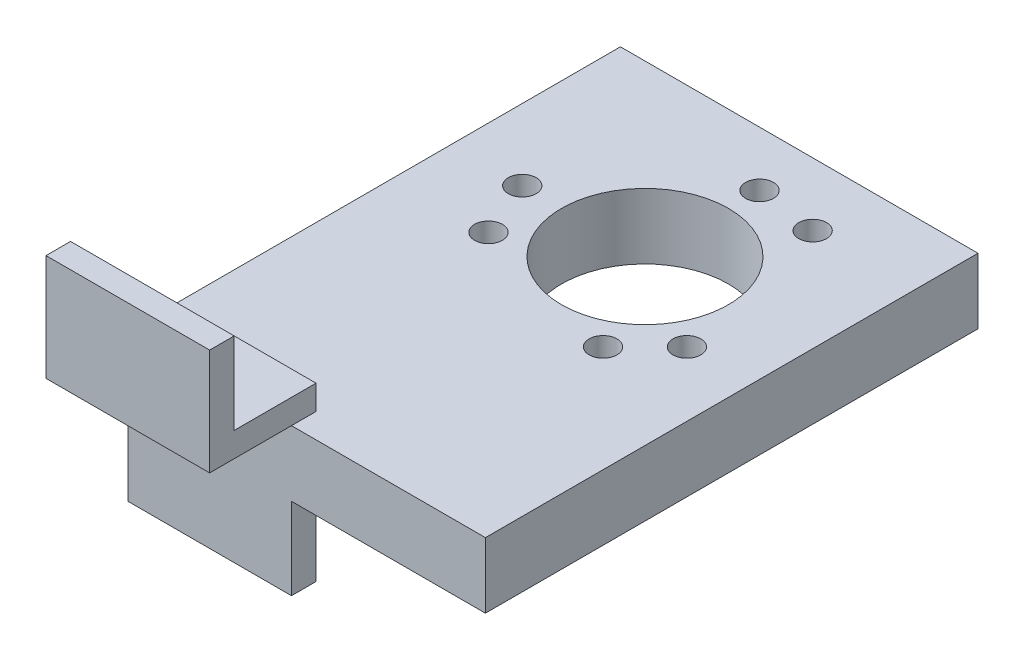
ISO-10303-21;
HEADER;
FILE_DESCRIPTION(('STEP AP214'),'2;1');
FILE_NAME('part.step','',(''),(''),'','','');
FILE_SCHEMA(('AUTOMOTIVE_DESIGN { 1 0 10303 214 1 1 1 1 }'));
ENDSEC;
DATA;
#1=APPLICATION_CONTEXT('core data for automotive mechanical design processes');
#2=APPLICATION_PROTOCOL_DEFINITION('international standard','automotive_design',2000,#1);
#3=PRODUCT_CONTEXT('',#1,'mechanical');
#4=PRODUCT('Part','Part','',(#3));
#5=PRODUCT_RELATED_PRODUCT_CATEGORY('part','',(#4));
#6=PRODUCT_DEFINITION_FORMATION('','',#4);
#7=PRODUCT_DEFINITION_CONTEXT('part definition',#1,'design');
#8=PRODUCT_DEFINITION('design','',#6,#7);
#9=PRODUCT_DEFINITION_SHAPE('','',#8);
#10=(LENGTH_UNIT() NAMED_UNIT(*) SI_UNIT(.MILLI.,.METRE.));
#11=(NAMED_UNIT(*) PLANE_ANGLE_UNIT() SI_UNIT($,.RADIAN.));
#12=(NAMED_UNIT(*) SI_UNIT($,.STERADIAN.) SOLID_ANGLE_UNIT());
#13=UNCERTAINTY_MEASURE_WITH_UNIT(LENGTH_MEASURE(1.E-05),#10,'distance_accuracy_value','');
#14=(GEOMETRIC_REPRESENTATION_CONTEXT(3) GLOBAL_UNCERTAINTY_ASSIGNED_CONTEXT((#13)) GLOBAL_UNIT_ASSIGNED_CONTEXT((#10,
#11,#12)) REPRESENTATION_CONTEXT('',''));
#15=CARTESIAN_POINT('',(0.,0.,0.));
#16=DIRECTION('',(0.,0.,1.));
#17=DIRECTION('',(1.,0.,0.));
#18=AXIS2_PLACEMENT_3D('',#15,#16,#17);
#19=CARTESIAN_POINT('',(0.,11.,0.));
#20=DIRECTION('',(0.,-1.,0.));
#21=DIRECTION('',(0.,0.,-1.));
#22=AXIS2_PLACEMENT_3D('',#19,#20,#21);
#23=PLANE('',#22);
#24=DIRECTION('',(-1.,0.,0.));
#25=VECTOR('',#24,1.);
#26=CARTESIAN_POINT('',(-23.7,11.,7.));
#27=LINE('',#26,#25);
#28=CARTESIAN_POINT('',(-3.7,11.,7.));
#29=VERTEX_POINT('',#28);
#30=CARTESIAN_POINT('',(-23.7,11.,7.));
#31=VERTEX_POINT('',#30);
#32=EDGE_CURVE('E57',#29,#31,#27,.T.);
#33=ORIENTED_EDGE('',*,*,#32,.F.);
#34=DIRECTION('',(0.,0.,-1.));
#35=VECTOR('',#34,1.);
#36=CARTESIAN_POINT('',(-3.7,11.,0.));
#37=LINE('',#36,#35);
#38=CARTESIAN_POINT('',(-3.7,11.,-3.));
#39=VERTEX_POINT('',#38);
#40=EDGE_CURVE('E199',#29,#39,#37,.T.);
#41=ORIENTED_EDGE('',*,*,#40,.T.);
#42=DIRECTION('',(-1.,0.,0.));
#43=VECTOR('',#42,1.);
#44=CARTESIAN_POINT('',(-23.7,11.,-3.));
#45=LINE('',#44,#43);
#46=CARTESIAN_POINT('',(-23.7,11.,-3.));
#47=VERTEX_POINT('',#46);
#48=EDGE_CURVE('E203',#39,#47,#45,.T.);
#49=ORIENTED_EDGE('',*,*,#48,.T.);
#50=DIRECTION('',(0.,0.,1.));
#51=VECTOR('',#50,1.);
#52=CARTESIAN_POINT('',(-23.7,11.,0.));
#53=LINE('',#52,#51);
#54=EDGE_CURVE('E196',#47,#31,#53,.T.);
#55=ORIENTED_EDGE('',*,*,#54,.T.);
#56=EDGE_LOOP('',(#33,#41,#49,#55));
#57=FACE_BOUND('',#56,.T.);
#58=ADVANCED_FACE('F41',(#57),#23,.F.);
#59=CARTESIAN_POINT('',(0.,8.,0.));
#60=DIRECTION('',(0.,0.,-1.));
#61=DIRECTION('',(-1.,0.,0.));
#62=AXIS2_PLACEMENT_3D('',#59,#60,#61);
#63=PLANE('',#62);
#64=DIRECTION('',(1.,0.,0.));
#65=VECTOR('',#64,1.);
#66=CARTESIAN_POINT('',(-23.7,8.,0.));
#67=LINE('',#66,#65);
#68=CARTESIAN_POINT('',(-23.7,8.,0.));
#69=VERTEX_POINT('',#68);
#70=CARTESIAN_POINT('',(-3.7,8.,0.));
#71=VERTEX_POINT('',#70);
#72=EDGE_CURVE('E65',#69,#71,#67,.T.);
#73=ORIENTED_EDGE('',*,*,#72,.F.);
#74=DIRECTION('',(0.,-1.,0.));
#75=VECTOR('',#74,1.);
#76=CARTESIAN_POINT('',(-23.7,8.,0.));
#77=LINE('',#76,#75);
#78=CARTESIAN_POINT('',(-23.7,-10.,0.));
#79=VERTEX_POINT('',#78);
#80=EDGE_CURVE('E342',#69,#79,#77,.T.);
#81=ORIENTED_EDGE('',*,*,#80,.T.);
#82=DIRECTION('',(-1.,0.,0.));
#83=VECTOR('',#82,1.);
#84=CARTESIAN_POINT('',(-23.7,-10.,0.));
#85=LINE('',#84,#83);
#86=CARTESIAN_POINT('',(-3.7,-10.,0.));
#87=VERTEX_POINT('',#86);
#88=EDGE_CURVE('E232',#87,#79,#85,.T.);
#89=ORIENTED_EDGE('',*,*,#88,.F.);
#90=DIRECTION('',(0.,1.,0.));
#91=VECTOR('',#90,1.);
#92=CARTESIAN_POINT('',(-3.7,-10.,0.));
#93=LINE('',#92,#91);
#94=CARTESIAN_POINT('',(-3.7,0.,0.));
#95=VERTEX_POINT('',#94);
#96=EDGE_CURVE('E236',#87,#95,#93,.T.);
#97=ORIENTED_EDGE('',*,*,#96,.T.);
#98=DIRECTION('',(1.,0.,0.));
#99=VECTOR('',#98,1.);
#100=CARTESIAN_POINT('',(0.,0.,0.));
#101=LINE('',#100,#99);
#102=CARTESIAN_POINT('',(20.,0.,0.));
#103=VERTEX_POINT('',#102);
#104=EDGE_CURVE('E333',#95,#103,#101,.T.);
#105=ORIENTED_EDGE('',*,*,#104,.T.);
#106=DIRECTION('',(0.,-1.,0.));
#107=VECTOR('',#106,1.);
#108=CARTESIAN_POINT('',(20.,8.,0.));
#109=LINE('',#108,#107);
#110=CARTESIAN_POINT('',(20.,8.,0.));
#111=VERTEX_POINT('',#110);
#112=EDGE_CURVE('E298',#111,#103,#109,.T.);
#113=ORIENTED_EDGE('',*,*,#112,.F.);
#114=DIRECTION('',(1.,0.,0.));
#115=VECTOR('',#114,1.);
#116=CARTESIAN_POINT('',(0.,8.,0.));
#117=LINE('',#116,#115);
#118=EDGE_CURVE('E291',#71,#111,#117,.T.);
#119=ORIENTED_EDGE('',*,*,#118,.F.);
#120=EDGE_LOOP('',(#73,#81,#89,#97,#105,#113,#119));
#121=FACE_BOUND('',#120,.T.);
#122=ADVANCED_FACE('F388',(#121),#63,.F.);
#123=CARTESIAN_POINT('',(0.,0.,0.));
#124=DIRECTION('',(0.,1.,0.));
#125=DIRECTION('',(0.,0.,1.));
#126=AXIS2_PLACEMENT_3D('',#123,#124,#125);
#127=PLANE('',#126);
#128=CARTESIAN_POINT('',(-12.1243556529821,0.,-32.5));
#129=DIRECTION('',(0.,1.,0.));
#130=DIRECTION('',(0.,0.,1.));
#131=AXIS2_PLACEMENT_3D('',#128,#129,#130);
#132=CIRCLE('',#131,1.7);
#133=CARTESIAN_POINT('',(-12.1243556529821,0.,-30.8));
#134=VERTEX_POINT('',#133);
#135=EDGE_CURVE('E260',#134,#134,#132,.T.);
#136=ORIENTED_EDGE('',*,*,#135,.T.);
#137=EDGE_LOOP('',(#136));
#138=FACE_BOUND('',#137,.T.);
#139=CARTESIAN_POINT('',(7.,0.,-27.3756443470179));
#140=DIRECTION('',(0.,1.,0.));
#141=DIRECTION('',(0.,0.,1.));
#142=AXIS2_PLACEMENT_3D('',#139,#140,#141);
#143=CIRCLE('',#142,1.7);
#144=CARTESIAN_POINT('',(7.,0.,-25.6756443470179));
#145=VERTEX_POINT('',#144);
#146=EDGE_CURVE('E318',#145,#145,#143,.T.);
#147=ORIENTED_EDGE('',*,*,#146,.T.);
#148=EDGE_LOOP('',(#147));
#149=FACE_BOUND('',#148,.T.);
#150=CARTESIAN_POINT('',(-15.,0.,-39.5));
#151=DIRECTION('',(0.,1.,0.));
#152=DIRECTION('',(0.,0.,1.));
#153=AXIS2_PLACEMENT_3D('',#150,#151,#152);
#154=CIRCLE('',#153,1.7);
#155=CARTESIAN_POINT('',(-15.,0.,-37.8));
#156=VERTEX_POINT('',#155);
#157=EDGE_CURVE('E314',#156,#156,#154,.T.);
#158=ORIENTED_EDGE('',*,*,#157,.T.);
#159=EDGE_LOOP('',(#158));
#160=FACE_BOUND('',#159,.T.);
#161=CARTESIAN_POINT('',(12.1243556529821,0.,-32.5));
#162=DIRECTION('',(0.,1.,0.));
#163=DIRECTION('',(0.,0.,1.));
#164=AXIS2_PLACEMENT_3D('',#161,#162,#163);
#165=CIRCLE('',#164,1.7);
#166=CARTESIAN_POINT('',(12.1243556529821,0.,-30.8));
#167=VERTEX_POINT('',#166);
#168=EDGE_CURVE('E310',#167,#167,#165,.T.);
#169=ORIENTED_EDGE('',*,*,#168,.T.);
#170=EDGE_LOOP('',(#169));
#171=FACE_BOUND('',#170,.T.);
#172=CARTESIAN_POINT('',(0.,0.,-39.5));
#173=DIRECTION('',(0.,1.,0.));
#174=DIRECTION('',(0.,0.,1.));
#175=AXIS2_PLACEMENT_3D('',#172,#173,#174);
#176=CIRCLE('',#175,10.2);
#177=CARTESIAN_POINT('',(0.,0.,-29.3));
#178=VERTEX_POINT('',#177);
#179=EDGE_CURVE('E306',#178,#178,#176,.T.);
#180=ORIENTED_EDGE('',*,*,#179,.T.);
#181=EDGE_LOOP('',(#180));
#182=FACE_BOUND('',#181,.T.);
#183=CARTESIAN_POINT('',(0.,0.,-53.5));
#184=DIRECTION('',(0.,1.,0.));
#185=DIRECTION('',(0.,0.,1.));
#186=AXIS2_PLACEMENT_3D('',#183,#184,#185);
#187=CIRCLE('',#186,1.7);
#188=CARTESIAN_POINT('',(0.,0.,-51.8));
#189=VERTEX_POINT('',#188);
#190=EDGE_CURVE('E302',#189,#189,#187,.T.);
#191=ORIENTED_EDGE('',*,*,#190,.T.);
#192=EDGE_LOOP('',(#191));
#193=FACE_BOUND('',#192,.T.);
#194=CARTESIAN_POINT('',(7.5,0.,-52.4903810567666));
#195=DIRECTION('',(0.,1.,0.));
#196=DIRECTION('',(0.,0.,1.));
#197=AXIS2_PLACEMENT_3D('',#194,#195,#196);
#198=CIRCLE('',#197,1.7);
#199=CARTESIAN_POINT('',(7.5,0.,-50.7903810567666));
#200=VERTEX_POINT('',#199);
#201=EDGE_CURVE('E254',#200,#200,#198,.T.);
#202=ORIENTED_EDGE('',*,*,#201,.T.);
#203=EDGE_LOOP('',(#202));
#204=FACE_BOUND('',#203,.T.);
#205=DIRECTION('',(0.,0.,1.));
#206=VECTOR('',#205,1.);
#207=CARTESIAN_POINT('',(-3.7,0.,0.));
#208=LINE('',#207,#206);
#209=CARTESIAN_POINT('',(-3.7,0.,-3.));
#210=VERTEX_POINT('',#209);
#211=EDGE_CURVE('E226',#210,#95,#208,.T.);
#212=ORIENTED_EDGE('',*,*,#211,.F.);
#213=DIRECTION('',(1.,0.,0.));
#214=VECTOR('',#213,1.);
#215=CARTESIAN_POINT('',(-23.7,0.,-3.));
#216=LINE('',#215,#214);
#217=CARTESIAN_POINT('',(-23.7,0.,-3.));
#218=VERTEX_POINT('',#217);
#219=EDGE_CURVE('E220',#218,#210,#216,.T.);
#220=ORIENTED_EDGE('',*,*,#219,.F.);
#221=DIRECTION('',(0.,0.,-1.));
#222=VECTOR('',#221,1.);
#223=CARTESIAN_POINT('',(-23.7,0.,0.));
#224=LINE('',#223,#222);
#225=CARTESIAN_POINT('',(-23.7,0.,-60.2));
#226=VERTEX_POINT('',#225);
#227=EDGE_CURVE('E330',#218,#226,#224,.T.);
#228=ORIENTED_EDGE('',*,*,#227,.T.);
#229=DIRECTION('',(1.,0.,0.));
#230=VECTOR('',#229,1.);
#231=CARTESIAN_POINT('',(0.,0.,-60.2));
#232=LINE('',#231,#230);
#233=CARTESIAN_POINT('',(20.,0.,-60.2));
#234=VERTEX_POINT('',#233);
#235=EDGE_CURVE('E326',#226,#234,#232,.T.);
#236=ORIENTED_EDGE('',*,*,#235,.T.);
#237=DIRECTION('',(0.,0.,1.));
#238=VECTOR('',#237,1.);
#239=CARTESIAN_POINT('',(20.,0.,0.));
#240=LINE('',#239,#238);
#241=EDGE_CURVE('E322',#234,#103,#240,.T.);
#242=ORIENTED_EDGE('',*,*,#241,.T.);
#243=ORIENTED_EDGE('',*,*,#104,.F.);
#244=EDGE_LOOP('',(#212,#220,#228,#236,#242,#243));
#245=FACE_BOUND('',#244,.T.);
#246=ADVANCED_FACE('F354',(#138,#149,#160,#171,#182,#193,#204,#245),#127,.F.);
#247=CARTESIAN_POINT('',(20.,8.,0.));
#248=DIRECTION('',(1.,0.,0.));
#249=DIRECTION('',(0.,0.,-1.));
#250=AXIS2_PLACEMENT_3D('',#247,#248,#249);
#251=PLANE('',#250);
#252=ORIENTED_EDGE('',*,*,#241,.F.);
#253=DIRECTION('',(0.,-1.,0.));
#254=VECTOR('',#253,1.);
#255=CARTESIAN_POINT('',(20.,8.,-60.2));
#256=LINE('',#255,#254);
#257=CARTESIAN_POINT('',(20.,8.,-60.2));
#258=VERTEX_POINT('',#257);
#259=EDGE_CURVE('E11',#258,#234,#256,.T.);
#260=ORIENTED_EDGE('',*,*,#259,.F.);
#261=DIRECTION('',(0.,0.,1.));
#262=VECTOR('',#261,1.);
#263=CARTESIAN_POINT('',(20.,8.,0.));
#264=LINE('',#263,#262);
#265=EDGE_CURVE('E280',#258,#111,#264,.T.);
#266=ORIENTED_EDGE('',*,*,#265,.T.);
#267=ORIENTED_EDGE('',*,*,#112,.T.);
#268=EDGE_LOOP('',(#252,#260,#266,#267));
#269=FACE_BOUND('',#268,.T.);
#270=ADVANCED_FACE('F387',(#269),#251,.T.);
#271=CARTESIAN_POINT('',(0.,8.,-60.2));
#272=DIRECTION('',(0.,0.,-1.));
#273=DIRECTION('',(-1.,0.,0.));
#274=AXIS2_PLACEMENT_3D('',#271,#272,#273);
#275=PLANE('',#274);
#276=ORIENTED_EDGE('',*,*,#235,.F.);
#277=DIRECTION('',(0.,-1.,0.));
#278=VECTOR('',#277,1.);
#279=CARTESIAN_POINT('',(-23.7,8.,-60.2));
#280=LINE('',#279,#278);
#281=CARTESIAN_POINT('',(-23.7,8.,-60.2));
#282=VERTEX_POINT('',#281);
#283=EDGE_CURVE('E50',#282,#226,#280,.T.);
#284=ORIENTED_EDGE('',*,*,#283,.F.);
#285=DIRECTION('',(1.,0.,0.));
#286=VECTOR('',#285,1.);
#287=CARTESIAN_POINT('',(0.,8.,-60.2));
#288=LINE('',#287,#286);
#289=EDGE_CURVE('E284',#282,#258,#288,.T.);
#290=ORIENTED_EDGE('',*,*,#289,.T.);
#291=ORIENTED_EDGE('',*,*,#259,.T.);
#292=EDGE_LOOP('',(#276,#284,#290,#291));
#293=FACE_BOUND('',#292,.T.);
#294=ADVANCED_FACE('F351',(#293),#275,.T.);
#295=CARTESIAN_POINT('',(-23.7,8.,0.));
#296=DIRECTION('',(-1.,0.,0.));
#297=DIRECTION('',(0.,0.,1.));
#298=AXIS2_PLACEMENT_3D('',#295,#296,#297);
#299=PLANE('',#298);
#300=ORIENTED_EDGE('',*,*,#227,.F.);
#301=DIRECTION('',(0.,1.,0.));
#302=VECTOR('',#301,1.);
#303=CARTESIAN_POINT('',(-23.7,-10.,-3.));
#304=LINE('',#303,#302);
#305=CARTESIAN_POINT('',(-23.7,-10.,-3.));
#306=VERTEX_POINT('',#305);
#307=EDGE_CURVE('E250',#306,#218,#304,.T.);
#308=ORIENTED_EDGE('',*,*,#307,.F.);
#309=DIRECTION('',(0.,0.,-1.));
#310=VECTOR('',#309,1.);
#311=CARTESIAN_POINT('',(-23.7,-10.,0.));
#312=LINE('',#311,#310);
#313=EDGE_CURVE('E221',#79,#306,#312,.T.);
#314=ORIENTED_EDGE('',*,*,#313,.F.);
#315=ORIENTED_EDGE('',*,*,#80,.F.);
#316=DIRECTION('',(0.,0.,-1.));
#317=VECTOR('',#316,1.);
#318=CARTESIAN_POINT('',(-23.7,8.,10.));
#319=LINE('',#318,#317);
#320=CARTESIAN_POINT('',(-23.7,8.,10.));
#321=VERTEX_POINT('',#320);
#322=EDGE_CURVE('E148',#321,#69,#319,.T.);
#323=ORIENTED_EDGE('',*,*,#322,.F.);
#324=DIRECTION('',(0.,-1.,0.));
#325=VECTOR('',#324,1.);
#326=CARTESIAN_POINT('',(-23.7,11.,10.));
#327=LINE('',#326,#325);
#328=CARTESIAN_POINT('',(-23.7,21.,10.));
#329=VERTEX_POINT('',#328);
#330=EDGE_CURVE('E140',#329,#321,#327,.T.);
#331=ORIENTED_EDGE('',*,*,#330,.F.);
#332=DIRECTION('',(0.,0.,1.));
#333=VECTOR('',#332,1.);
#334=CARTESIAN_POINT('',(-23.7,21.,10.));
#335=LINE('',#334,#333);
#336=CARTESIAN_POINT('',(-23.7,21.,7.));
#337=VERTEX_POINT('',#336);
#338=EDGE_CURVE('E146',#337,#329,#335,.T.);
#339=ORIENTED_EDGE('',*,*,#338,.F.);
#340=DIRECTION('',(0.,-1.,0.));
#341=VECTOR('',#340,1.);
#342=CARTESIAN_POINT('',(-23.7,21.,7.));
#343=LINE('',#342,#341);
#344=EDGE_CURVE('E175',#337,#31,#343,.T.);
#345=ORIENTED_EDGE('',*,*,#344,.T.);
#346=ORIENTED_EDGE('',*,*,#54,.F.);
#347=DIRECTION('',(0.,-1.,0.));
#348=VECTOR('',#347,1.);
#349=CARTESIAN_POINT('',(-23.7,11.,-3.));
#350=LINE('',#349,#348);
#351=CARTESIAN_POINT('',(-23.7,8.,-3.));
#352=VERTEX_POINT('',#351);
#353=EDGE_CURVE('E206',#47,#352,#350,.T.);
#354=ORIENTED_EDGE('',*,*,#353,.T.);
#355=DIRECTION('',(0.,0.,-1.));
#356=VECTOR('',#355,1.);
#357=CARTESIAN_POINT('',(-23.7,8.,0.));
#358=LINE('',#357,#356);
#359=EDGE_CURVE('E288',#352,#282,#358,.T.);
#360=ORIENTED_EDGE('',*,*,#359,.T.);
#361=ORIENTED_EDGE('',*,*,#283,.T.);
#362=EDGE_LOOP('',(#300,#308,#314,#315,#323,#331,#339,#345,#346,#354,#360,#361));
#363=FACE_BOUND('',#362,.T.);
#364=ADVANCED_FACE('F143',(#363),#299,.T.);
#365=CARTESIAN_POINT('',(7.,8.,-27.3756443470179));
#366=DIRECTION('',(0.,-1.,0.));
#367=DIRECTION('',(0.,0.,-1.));
#368=AXIS2_PLACEMENT_3D('',#365,#366,#367);
#369=CYLINDRICAL_SURFACE('',#368,1.7);
#370=CARTESIAN_POINT('',(7.,8.,-27.3756443470179));
#371=DIRECTION('',(0.,1.,0.));
#372=DIRECTION('',(0.,0.,1.));
#373=AXIS2_PLACEMENT_3D('',#370,#371,#372);
#374=CIRCLE('',#373,1.7);
#375=CARTESIAN_POINT('',(7.,8.,-25.6756443470179));
#376=VERTEX_POINT('',#375);
#377=EDGE_CURVE('E276',#376,#376,#374,.T.);
#378=ORIENTED_EDGE('',*,*,#377,.T.);
#379=EDGE_LOOP('',(#378));
#380=FACE_BOUND('',#379,.T.);
#381=ORIENTED_EDGE('',*,*,#146,.F.);
#382=EDGE_LOOP('',(#381));
#383=FACE_BOUND('',#382,.T.);
#384=ADVANCED_FACE('F403',(#380,#383),#369,.F.);
#385=CARTESIAN_POINT('',(-15.,8.,-39.5));
#386=DIRECTION('',(0.,-1.,0.));
#387=DIRECTION('',(0.,0.,-1.));
#388=AXIS2_PLACEMENT_3D('',#385,#386,#387);
#389=CYLINDRICAL_SURFACE('',#388,1.7);
#390=CARTESIAN_POINT('',(-15.,8.,-39.5));
#391=DIRECTION('',(0.,1.,0.));
#392=DIRECTION('',(0.,0.,1.));
#393=AXIS2_PLACEMENT_3D('',#390,#391,#392);
#394=CIRCLE('',#393,1.7);
#395=CARTESIAN_POINT('',(-15.,8.,-37.8));
#396=VERTEX_POINT('',#395);
#397=EDGE_CURVE('E272',#396,#396,#394,.T.);
#398=ORIENTED_EDGE('',*,*,#397,.T.);
#399=EDGE_LOOP('',(#398));
#400=FACE_BOUND('',#399,.T.);
#401=ORIENTED_EDGE('',*,*,#157,.F.);
#402=EDGE_LOOP('',(#401));
#403=FACE_BOUND('',#402,.T.);
#404=ADVANCED_FACE('F410',(#400,#403),#389,.F.);
#405=CARTESIAN_POINT('',(12.1243556529821,8.,-32.5));
#406=DIRECTION('',(0.,-1.,0.));
#407=DIRECTION('',(0.,0.,-1.));
#408=AXIS2_PLACEMENT_3D('',#405,#406,#407);
#409=CYLINDRICAL_SURFACE('',#408,1.7);
#410=CARTESIAN_POINT('',(12.1243556529821,8.,-32.5));
#411=DIRECTION('',(0.,1.,0.));
#412=DIRECTION('',(0.,0.,1.));
#413=AXIS2_PLACEMENT_3D('',#410,#411,#412);
#414=CIRCLE('',#413,1.7);
#415=CARTESIAN_POINT('',(12.1243556529821,8.,-30.8));
#416=VERTEX_POINT('',#415);
#417=EDGE_CURVE('E268',#416,#416,#414,.T.);
#418=ORIENTED_EDGE('',*,*,#417,.T.);
#419=EDGE_LOOP('',(#418));
#420=FACE_BOUND('',#419,.T.);
#421=ORIENTED_EDGE('',*,*,#168,.F.);
#422=EDGE_LOOP('',(#421));
#423=FACE_BOUND('',#422,.T.);
#424=ADVANCED_FACE('F414',(#420,#423),#409,.F.);
#425=CARTESIAN_POINT('',(0.,8.,-39.5));
#426=DIRECTION('',(0.,-1.,0.));
#427=DIRECTION('',(0.,0.,-1.));
#428=AXIS2_PLACEMENT_3D('',#425,#426,#427);
#429=CYLINDRICAL_SURFACE('',#428,10.2);
#430=CARTESIAN_POINT('',(0.,8.,-39.5));
#431=DIRECTION('',(0.,1.,0.));
#432=DIRECTION('',(0.,0.,1.));
#433=AXIS2_PLACEMENT_3D('',#430,#431,#432);
#434=CIRCLE('',#433,10.2);
#435=CARTESIAN_POINT('',(0.,8.,-29.3));
#436=VERTEX_POINT('',#435);
#437=EDGE_CURVE('E264',#436,#436,#434,.T.);
#438=ORIENTED_EDGE('',*,*,#437,.T.);
#439=EDGE_LOOP('',(#438));
#440=FACE_BOUND('',#439,.T.);
#441=ORIENTED_EDGE('',*,*,#179,.F.);
#442=EDGE_LOOP('',(#441));
#443=FACE_BOUND('',#442,.T.);
#444=ADVANCED_FACE('F418',(#440,#443),#429,.F.);
#445=CARTESIAN_POINT('',(0.,8.,-53.5));
#446=DIRECTION('',(0.,-1.,0.));
#447=DIRECTION('',(0.,0.,-1.));
#448=AXIS2_PLACEMENT_3D('',#445,#446,#447);
#449=CYLINDRICAL_SURFACE('',#448,1.7);
#450=CARTESIAN_POINT('',(0.,8.,-53.5));
#451=DIRECTION('',(0.,1.,0.));
#452=DIRECTION('',(0.,0.,1.));
#453=AXIS2_PLACEMENT_3D('',#450,#451,#452);
#454=CIRCLE('',#453,1.7);
#455=CARTESIAN_POINT('',(0.,8.,-51.8));
#456=VERTEX_POINT('',#455);
#457=EDGE_CURVE('E259',#456,#456,#454,.T.);
#458=ORIENTED_EDGE('',*,*,#457,.T.);
#459=EDGE_LOOP('',(#458));
#460=FACE_BOUND('',#459,.T.);
#461=ORIENTED_EDGE('',*,*,#190,.F.);
#462=EDGE_LOOP('',(#461));
#463=FACE_BOUND('',#462,.T.);
#464=ADVANCED_FACE('F421',(#460,#463),#449,.F.);
#465=CARTESIAN_POINT('',(7.5,8.,-52.4903810567666));
#466=DIRECTION('',(0.,-1.,0.));
#467=DIRECTION('',(0.,0.,-1.));
#468=AXIS2_PLACEMENT_3D('',#465,#466,#467);
#469=CYLINDRICAL_SURFACE('',#468,1.7);
#470=CARTESIAN_POINT('',(7.5,8.,-52.4903810567666));
#471=DIRECTION('',(0.,1.,0.));
#472=DIRECTION('',(0.,0.,1.));
#473=AXIS2_PLACEMENT_3D('',#470,#471,#472);
#474=CIRCLE('',#473,1.7);
#475=CARTESIAN_POINT('',(7.5,8.,-50.7903810567666));
#476=VERTEX_POINT('',#475);
#477=EDGE_CURVE('E255',#476,#476,#474,.T.);
#478=ORIENTED_EDGE('',*,*,#477,.T.);
#479=EDGE_LOOP('',(#478));
#480=FACE_BOUND('',#479,.T.);
#481=ORIENTED_EDGE('',*,*,#201,.F.);
#482=EDGE_LOOP('',(#481));
#483=FACE_BOUND('',#482,.T.);
#484=ADVANCED_FACE('F43',(#480,#483),#469,.F.);
#485=CARTESIAN_POINT('',(-12.1243556529821,8.,-32.5));
#486=DIRECTION('',(0.,-1.,0.));
#487=DIRECTION('',(0.,0.,-1.));
#488=AXIS2_PLACEMENT_3D('',#485,#486,#487);
#489=CYLINDRICAL_SURFACE('',#488,1.7);
#490=CARTESIAN_POINT('',(-12.1243556529821,8.,-32.5));
#491=DIRECTION('',(0.,1.,0.));
#492=DIRECTION('',(0.,0.,1.));
#493=AXIS2_PLACEMENT_3D('',#490,#491,#492);
#494=CIRCLE('',#493,1.7);
#495=CARTESIAN_POINT('',(-12.1243556529821,8.,-30.8));
#496=VERTEX_POINT('',#495);
#497=EDGE_CURVE('E294',#496,#496,#494,.T.);
#498=ORIENTED_EDGE('',*,*,#497,.T.);
#499=EDGE_LOOP('',(#498));
#500=FACE_BOUND('',#499,.T.);
#501=ORIENTED_EDGE('',*,*,#135,.F.);
#502=EDGE_LOOP('',(#501));
#503=FACE_BOUND('',#502,.T.);
#504=ADVANCED_FACE('F400',(#500,#503),#489,.F.);
#505=CARTESIAN_POINT('',(0.,8.,0.));
#506=DIRECTION('',(0.,1.,0.));
#507=DIRECTION('',(0.,0.,1.));
#508=AXIS2_PLACEMENT_3D('',#505,#506,#507);
#509=PLANE('',#508);
#510=DIRECTION('',(-1.,0.,0.));
#511=VECTOR('',#510,1.);
#512=CARTESIAN_POINT('',(-23.7,8.,-3.));
#513=LINE('',#512,#511);
#514=CARTESIAN_POINT('',(-3.7,8.,-3.));
#515=VERTEX_POINT('',#514);
#516=EDGE_CURVE('E200',#515,#352,#513,.T.);
#517=ORIENTED_EDGE('',*,*,#516,.F.);
#518=DIRECTION('',(0.,0.,-1.));
#519=VECTOR('',#518,1.);
#520=CARTESIAN_POINT('',(-3.7,8.,0.));
#521=LINE('',#520,#519);
#522=EDGE_CURVE('E195',#71,#515,#521,.T.);
#523=ORIENTED_EDGE('',*,*,#522,.F.);
#524=ORIENTED_EDGE('',*,*,#118,.T.);
#525=ORIENTED_EDGE('',*,*,#265,.F.);
#526=ORIENTED_EDGE('',*,*,#289,.F.);
#527=ORIENTED_EDGE('',*,*,#359,.F.);
#528=EDGE_LOOP('',(#517,#523,#524,#525,#526,#527));
#529=FACE_BOUND('',#528,.T.);
#530=ORIENTED_EDGE('',*,*,#477,.F.);
#531=EDGE_LOOP('',(#530));
#532=FACE_BOUND('',#531,.T.);
#533=ORIENTED_EDGE('',*,*,#457,.F.);
#534=EDGE_LOOP('',(#533));
#535=FACE_BOUND('',#534,.T.);
#536=ORIENTED_EDGE('',*,*,#437,.F.);
#537=EDGE_LOOP('',(#536));
#538=FACE_BOUND('',#537,.T.);
#539=ORIENTED_EDGE('',*,*,#417,.F.);
#540=EDGE_LOOP('',(#539));
#541=FACE_BOUND('',#540,.T.);
#542=ORIENTED_EDGE('',*,*,#397,.F.);
#543=EDGE_LOOP('',(#542));
#544=FACE_BOUND('',#543,.T.);
#545=ORIENTED_EDGE('',*,*,#377,.F.);
#546=EDGE_LOOP('',(#545));
#547=FACE_BOUND('',#546,.T.);
#548=ORIENTED_EDGE('',*,*,#497,.F.);
#549=EDGE_LOOP('',(#548));
#550=FACE_BOUND('',#549,.T.);
#551=ADVANCED_FACE('F382',(#529,#532,#535,#538,#541,#544,#547,#550),#509,.T.);
#552=CARTESIAN_POINT('',(-23.7,-10.,-3.));
#553=DIRECTION('',(0.,0.,1.));
#554=DIRECTION('',(1.,0.,0.));
#555=AXIS2_PLACEMENT_3D('',#552,#553,#554);
#556=PLANE('',#555);
#557=ORIENTED_EDGE('',*,*,#219,.T.);
#558=DIRECTION('',(0.,1.,0.));
#559=VECTOR('',#558,1.);
#560=CARTESIAN_POINT('',(-3.7,-10.,-3.));
#561=LINE('',#560,#559);
#562=CARTESIAN_POINT('',(-3.7,-10.,-3.));
#563=VERTEX_POINT('',#562);
#564=EDGE_CURVE('E246',#563,#210,#561,.T.);
#565=ORIENTED_EDGE('',*,*,#564,.F.);
#566=DIRECTION('',(1.,0.,0.));
#567=VECTOR('',#566,1.);
#568=CARTESIAN_POINT('',(-23.7,-10.,-3.));
#569=LINE('',#568,#567);
#570=EDGE_CURVE('E225',#306,#563,#569,.T.);
#571=ORIENTED_EDGE('',*,*,#570,.F.);
#572=ORIENTED_EDGE('',*,*,#307,.T.);
#573=EDGE_LOOP('',(#557,#565,#571,#572));
#574=FACE_BOUND('',#573,.T.);
#575=ADVANCED_FACE('F357',(#574),#556,.F.);
#576=CARTESIAN_POINT('',(-3.7,-10.,0.));
#577=DIRECTION('',(-1.,0.,0.));
#578=DIRECTION('',(0.,0.,1.));
#579=AXIS2_PLACEMENT_3D('',#576,#577,#578);
#580=PLANE('',#579);
#581=ORIENTED_EDGE('',*,*,#211,.T.);
#582=ORIENTED_EDGE('',*,*,#96,.F.);
#583=DIRECTION('',(0.,0.,1.));
#584=VECTOR('',#583,1.);
#585=CARTESIAN_POINT('',(-3.7,-10.,0.));
#586=LINE('',#585,#584);
#587=EDGE_CURVE('E229',#563,#87,#586,.T.);
#588=ORIENTED_EDGE('',*,*,#587,.F.);
#589=ORIENTED_EDGE('',*,*,#564,.T.);
#590=EDGE_LOOP('',(#581,#582,#588,#589));
#591=FACE_BOUND('',#590,.T.);
#592=ADVANCED_FACE('F360',(#591),#580,.F.);
#593=CARTESIAN_POINT('',(0.,-10.,0.));
#594=DIRECTION('',(0.,-1.,0.));
#595=DIRECTION('',(0.,0.,-1.));
#596=AXIS2_PLACEMENT_3D('',#593,#594,#595);
#597=PLANE('',#596);
#598=ORIENTED_EDGE('',*,*,#313,.T.);
#599=ORIENTED_EDGE('',*,*,#570,.T.);
#600=ORIENTED_EDGE('',*,*,#587,.T.);
#601=ORIENTED_EDGE('',*,*,#88,.T.);
#602=EDGE_LOOP('',(#598,#599,#600,#601));
#603=FACE_BOUND('',#602,.T.);
#604=ADVANCED_FACE('F364',(#603),#597,.T.);
#605=CARTESIAN_POINT('',(-3.7,11.,0.));
#606=DIRECTION('',(-1.,0.,0.));
#607=DIRECTION('',(0.,0.,1.));
#608=AXIS2_PLACEMENT_3D('',#605,#606,#607);
#609=PLANE('',#608);
#610=ORIENTED_EDGE('',*,*,#522,.T.);
#611=DIRECTION('',(0.,-1.,0.));
#612=VECTOR('',#611,1.);
#613=CARTESIAN_POINT('',(-3.7,11.,-3.));
#614=LINE('',#613,#612);
#615=EDGE_CURVE('E216',#39,#515,#614,.T.);
#616=ORIENTED_EDGE('',*,*,#615,.F.);
#617=ORIENTED_EDGE('',*,*,#40,.F.);
#618=DIRECTION('',(0.,-1.,0.));
#619=VECTOR('',#618,1.);
#620=CARTESIAN_POINT('',(-3.7,21.,7.));
#621=LINE('',#620,#619);
#622=CARTESIAN_POINT('',(-3.7,21.,7.));
#623=VERTEX_POINT('',#622);
#624=EDGE_CURVE('E179',#623,#29,#621,.T.);
#625=ORIENTED_EDGE('',*,*,#624,.F.);
#626=DIRECTION('',(0.,0.,-1.));
#627=VECTOR('',#626,1.);
#628=CARTESIAN_POINT('',(-3.7,21.,10.));
#629=LINE('',#628,#627);
#630=CARTESIAN_POINT('',(-3.7,21.,10.));
#631=VERTEX_POINT('',#630);
#632=EDGE_CURVE('E161',#631,#623,#629,.T.);
#633=ORIENTED_EDGE('',*,*,#632,.F.);
#634=DIRECTION('',(0.,1.,0.));
#635=VECTOR('',#634,1.);
#636=CARTESIAN_POINT('',(-3.7,11.,10.));
#637=LINE('',#636,#635);
#638=CARTESIAN_POINT('',(-3.7,8.,10.));
#639=VERTEX_POINT('',#638);
#640=EDGE_CURVE('E157',#639,#631,#637,.T.);
#641=ORIENTED_EDGE('',*,*,#640,.F.);
#642=DIRECTION('',(0.,0.,-1.));
#643=VECTOR('',#642,1.);
#644=CARTESIAN_POINT('',(-3.7,8.,10.));
#645=LINE('',#644,#643);
#646=EDGE_CURVE('E187',#639,#71,#645,.T.);
#647=ORIENTED_EDGE('',*,*,#646,.T.);
#648=EDGE_LOOP('',(#610,#616,#617,#625,#633,#641,#647));
#649=FACE_BOUND('',#648,.T.);
#650=ADVANCED_FACE('F370',(#649),#609,.F.);
#651=CARTESIAN_POINT('',(-23.7,11.,-3.));
#652=DIRECTION('',(0.,0.,1.));
#653=DIRECTION('',(1.,0.,0.));
#654=AXIS2_PLACEMENT_3D('',#651,#652,#653);
#655=PLANE('',#654);
#656=ORIENTED_EDGE('',*,*,#516,.T.);
#657=ORIENTED_EDGE('',*,*,#353,.F.);
#658=ORIENTED_EDGE('',*,*,#48,.F.);
#659=ORIENTED_EDGE('',*,*,#615,.T.);
#660=EDGE_LOOP('',(#656,#657,#658,#659));
#661=FACE_BOUND('',#660,.T.);
#662=ADVANCED_FACE('F379',(#661),#655,.F.);
#663=CARTESIAN_POINT('',(-23.7,8.,10.));
#664=DIRECTION('',(0.,1.,0.));
#665=DIRECTION('',(0.,0.,1.));
#666=AXIS2_PLACEMENT_3D('',#663,#664,#665);
#667=PLANE('',#666);
#668=ORIENTED_EDGE('',*,*,#72,.T.);
#669=ORIENTED_EDGE('',*,*,#646,.F.);
#670=DIRECTION('',(1.,0.,0.));
#671=VECTOR('',#670,1.);
#672=CARTESIAN_POINT('',(-23.7,8.,10.));
#673=LINE('',#672,#671);
#674=EDGE_CURVE('E151',#321,#639,#673,.T.);
#675=ORIENTED_EDGE('',*,*,#674,.F.);
#676=ORIENTED_EDGE('',*,*,#322,.T.);
#677=EDGE_LOOP('',(#668,#669,#675,#676));
#678=FACE_BOUND('',#677,.T.);
#679=ADVANCED_FACE('F367',(#678),#667,.F.);
#680=CARTESIAN_POINT('',(0.,0.,10.));
#681=DIRECTION('',(0.,0.,1.));
#682=DIRECTION('',(1.,0.,0.));
#683=AXIS2_PLACEMENT_3D('',#680,#681,#682);
#684=PLANE('',#683);
#685=ORIENTED_EDGE('',*,*,#330,.T.);
#686=ORIENTED_EDGE('',*,*,#674,.T.);
#687=ORIENTED_EDGE('',*,*,#640,.T.);
#688=DIRECTION('',(1.,0.,0.));
#689=VECTOR('',#688,1.);
#690=CARTESIAN_POINT('',(-23.7,21.,10.));
#691=LINE('',#690,#689);
#692=EDGE_CURVE('E154',#329,#631,#691,.T.);
#693=ORIENTED_EDGE('',*,*,#692,.F.);
#694=EDGE_LOOP('',(#685,#686,#687,#693));
#695=FACE_BOUND('',#694,.T.);
#696=ADVANCED_FACE('F155',(#695),#684,.T.);
#697=CARTESIAN_POINT('',(-23.7,21.,7.));
#698=DIRECTION('',(0.,0.,1.));
#699=DIRECTION('',(1.,0.,0.));
#700=AXIS2_PLACEMENT_3D('',#697,#698,#699);
#701=PLANE('',#700);
#702=ORIENTED_EDGE('',*,*,#32,.T.);
#703=ORIENTED_EDGE('',*,*,#344,.F.);
#704=DIRECTION('',(-1.,0.,0.));
#705=VECTOR('',#704,1.);
#706=CARTESIAN_POINT('',(-23.7,21.,7.));
#707=LINE('',#706,#705);
#708=EDGE_CURVE('E165',#623,#337,#707,.T.);
#709=ORIENTED_EDGE('',*,*,#708,.F.);
#710=ORIENTED_EDGE('',*,*,#624,.T.);
#711=EDGE_LOOP('',(#702,#703,#709,#710));
#712=FACE_BOUND('',#711,.T.);
#713=ADVANCED_FACE('F374',(#712),#701,.F.);
#714=CARTESIAN_POINT('',(0.,21.,0.));
#715=DIRECTION('',(0.,-1.,0.));
#716=DIRECTION('',(0.,0.,-1.));
#717=AXIS2_PLACEMENT_3D('',#714,#715,#716);
#718=PLANE('',#717);
#719=ORIENTED_EDGE('',*,*,#338,.T.);
#720=ORIENTED_EDGE('',*,*,#692,.T.);
#721=ORIENTED_EDGE('',*,*,#632,.T.);
#722=ORIENTED_EDGE('',*,*,#708,.T.);
#723=EDGE_LOOP('',(#719,#720,#721,#722));
#724=FACE_BOUND('',#723,.T.);
#725=ADVANCED_FACE('F163',(#724),#718,.F.);
#726=CLOSED_SHELL('',(#58,#122,#246,#270,#294,#364,#384,#404,#424,#444,#464,#484,#504,#551,#575,
#592,#604,#650,#662,#679,#696,#713,#725));
#727=MANIFOLD_SOLID_BREP('B2',#726);
#728=ADVANCED_BREP_SHAPE_REPRESENTATION('',(#18,#727),#14);
#729=SHAPE_DEFINITION_REPRESENTATION(#9,#728);
ENDSEC;
END-ISO-10303-21;
